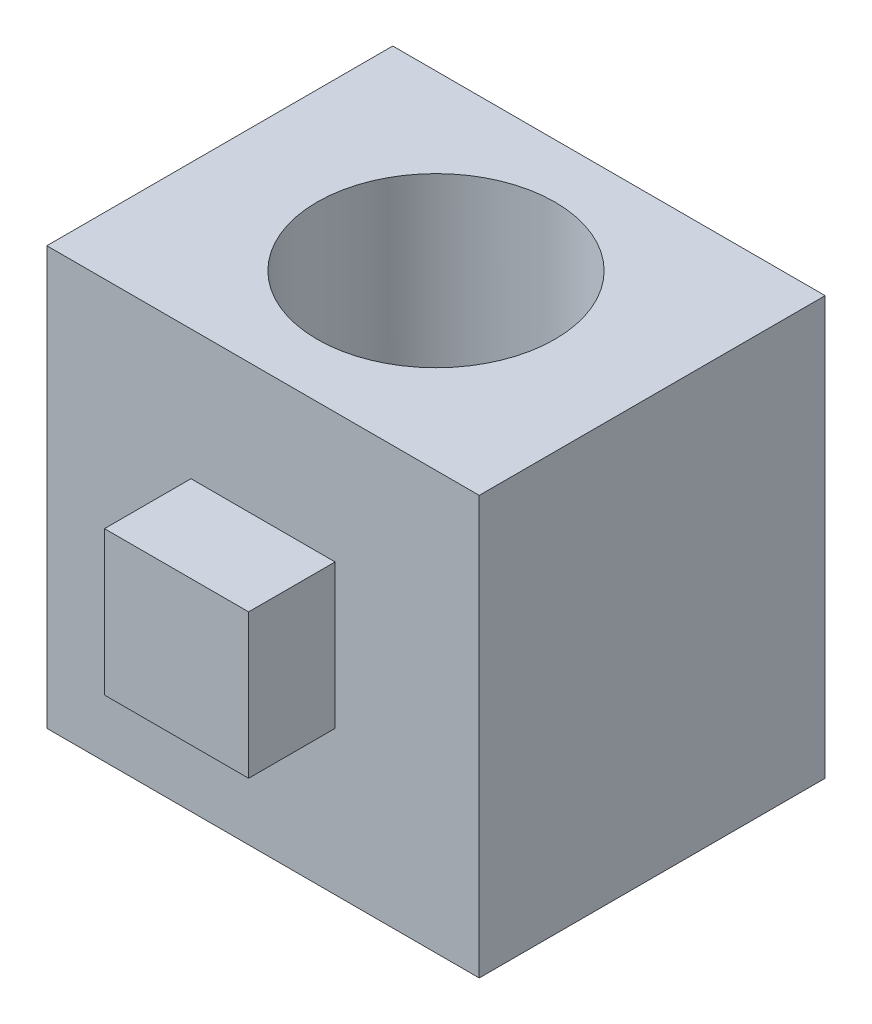
ISO-10303-21;
HEADER;
FILE_DESCRIPTION(('STEP AP214'),'2;1');
FILE_NAME('part.step','',(''),(''),'','','');
FILE_SCHEMA(('AUTOMOTIVE_DESIGN { 1 0 10303 214 1 1 1 1 }'));
ENDSEC;
DATA;
#1=APPLICATION_CONTEXT('core data for automotive mechanical design processes');
#2=APPLICATION_PROTOCOL_DEFINITION('international standard','automotive_design',2000,#1);
#3=PRODUCT_CONTEXT('',#1,'mechanical');
#4=PRODUCT('Part','Part','',(#3));
#5=PRODUCT_RELATED_PRODUCT_CATEGORY('part','',(#4));
#6=PRODUCT_DEFINITION_FORMATION('','',#4);
#7=PRODUCT_DEFINITION_CONTEXT('part definition',#1,'design');
#8=PRODUCT_DEFINITION('design','',#6,#7);
#9=PRODUCT_DEFINITION_SHAPE('','',#8);
#10=(LENGTH_UNIT() NAMED_UNIT(*) SI_UNIT(.MILLI.,.METRE.));
#11=(NAMED_UNIT(*) PLANE_ANGLE_UNIT() SI_UNIT($,.RADIAN.));
#12=(NAMED_UNIT(*) SI_UNIT($,.STERADIAN.) SOLID_ANGLE_UNIT());
#13=UNCERTAINTY_MEASURE_WITH_UNIT(LENGTH_MEASURE(1.E-05),#10,'distance_accuracy_value','');
#14=(GEOMETRIC_REPRESENTATION_CONTEXT(3) GLOBAL_UNCERTAINTY_ASSIGNED_CONTEXT((#13)) GLOBAL_UNIT_ASSIGNED_CONTEXT((#10,
#11,#12)) REPRESENTATION_CONTEXT('',''));
#15=CARTESIAN_POINT('',(0.,0.,0.));
#16=DIRECTION('',(0.,0.,1.));
#17=DIRECTION('',(1.,0.,0.));
#18=AXIS2_PLACEMENT_3D('',#15,#16,#17);
#19=CARTESIAN_POINT('',(-15.,29.,12.));
#20=DIRECTION('',(1.,0.,0.));
#21=DIRECTION('',(0.,0.,-1.));
#22=AXIS2_PLACEMENT_3D('',#19,#20,#21);
#23=PLANE('',#22);
#24=DIRECTION('',(0.,-1.,0.));
#25=VECTOR('',#24,1.);
#26=CARTESIAN_POINT('',(-15.,29.,-12.));
#27=LINE('',#26,#25);
#28=CARTESIAN_POINT('',(-15.,29.,-12.));
#29=VERTEX_POINT('',#28);
#30=CARTESIAN_POINT('',(-15.,0.,-12.));
#31=VERTEX_POINT('',#30);
#32=EDGE_CURVE('E134',#29,#31,#27,.T.);
#33=ORIENTED_EDGE('',*,*,#32,.T.);
#34=DIRECTION('',(0.,0.,-1.));
#35=VECTOR('',#34,1.);
#36=CARTESIAN_POINT('',(-15.,0.,12.));
#37=LINE('',#36,#35);
#38=CARTESIAN_POINT('',(-15.,0.,12.));
#39=VERTEX_POINT('',#38);
#40=EDGE_CURVE('E11',#39,#31,#37,.T.);
#41=ORIENTED_EDGE('',*,*,#40,.F.);
#42=DIRECTION('',(0.,-1.,0.));
#43=VECTOR('',#42,1.);
#44=CARTESIAN_POINT('',(-15.,29.,12.));
#45=LINE('',#44,#43);
#46=CARTESIAN_POINT('',(-15.,29.,12.));
#47=VERTEX_POINT('',#46);
#48=EDGE_CURVE('E139',#47,#39,#45,.T.);
#49=ORIENTED_EDGE('',*,*,#48,.F.);
#50=DIRECTION('',(0.,0.,-1.));
#51=VECTOR('',#50,1.);
#52=CARTESIAN_POINT('',(-15.,29.,12.));
#53=LINE('',#52,#51);
#54=EDGE_CURVE('E148',#47,#29,#53,.T.);
#55=ORIENTED_EDGE('',*,*,#54,.T.);
#56=EDGE_LOOP('',(#33,#41,#49,#55));
#57=FACE_BOUND('',#56,.T.);
#58=ADVANCED_FACE('F41',(#57),#23,.F.);
#59=CARTESIAN_POINT('',(-15.,0.,12.));
#60=DIRECTION('',(0.,1.,0.));
#61=DIRECTION('',(0.,0.,1.));
#62=AXIS2_PLACEMENT_3D('',#59,#60,#61);
#63=PLANE('',#62);
#64=CARTESIAN_POINT('',(0.,0.,0.));
#65=DIRECTION('',(0.,1.,0.));
#66=DIRECTION('',(0.,0.,1.));
#67=AXIS2_PLACEMENT_3D('',#64,#65,#66);
#68=CIRCLE('',#67,8.25);
#69=CARTESIAN_POINT('',(0.,0.,8.25));
#70=VERTEX_POINT('',#69);
#71=EDGE_CURVE('E126',#70,#70,#68,.T.);
#72=ORIENTED_EDGE('',*,*,#71,.T.);
#73=EDGE_LOOP('',(#72));
#74=FACE_BOUND('',#73,.T.);
#75=DIRECTION('',(1.,0.,0.));
#76=VECTOR('',#75,1.);
#77=CARTESIAN_POINT('',(-15.,0.,-12.));
#78=LINE('',#77,#76);
#79=CARTESIAN_POINT('',(15.,0.,-12.));
#80=VERTEX_POINT('',#79);
#81=EDGE_CURVE('E149',#31,#80,#78,.T.);
#82=ORIENTED_EDGE('',*,*,#81,.T.);
#83=DIRECTION('',(0.,0.,-1.));
#84=VECTOR('',#83,1.);
#85=CARTESIAN_POINT('',(15.,0.,12.));
#86=LINE('',#85,#84);
#87=CARTESIAN_POINT('',(15.,0.,12.));
#88=VERTEX_POINT('',#87);
#89=EDGE_CURVE('E47',#88,#80,#86,.T.);
#90=ORIENTED_EDGE('',*,*,#89,.F.);
#91=DIRECTION('',(1.,0.,0.));
#92=VECTOR('',#91,1.);
#93=CARTESIAN_POINT('',(-15.,0.,12.));
#94=LINE('',#93,#92);
#95=EDGE_CURVE('E138',#39,#88,#94,.T.);
#96=ORIENTED_EDGE('',*,*,#95,.F.);
#97=ORIENTED_EDGE('',*,*,#40,.T.);
#98=EDGE_LOOP('',(#82,#90,#96,#97));
#99=FACE_BOUND('',#98,.T.);
#100=ADVANCED_FACE('F177',(#74,#99),#63,.F.);
#101=CARTESIAN_POINT('',(15.,0.,12.));
#102=DIRECTION('',(-1.,0.,0.));
#103=DIRECTION('',(0.,0.,1.));
#104=AXIS2_PLACEMENT_3D('',#101,#102,#103);
#105=PLANE('',#104);
#106=DIRECTION('',(0.,1.,0.));
#107=VECTOR('',#106,1.);
#108=CARTESIAN_POINT('',(15.,0.,-12.));
#109=LINE('',#108,#107);
#110=CARTESIAN_POINT('',(15.,29.,-12.));
#111=VERTEX_POINT('',#110);
#112=EDGE_CURVE('E151',#80,#111,#109,.T.);
#113=ORIENTED_EDGE('',*,*,#112,.T.);
#114=DIRECTION('',(0.,0.,-1.));
#115=VECTOR('',#114,1.);
#116=CARTESIAN_POINT('',(15.,29.,12.));
#117=LINE('',#116,#115);
#118=CARTESIAN_POINT('',(15.,29.,12.));
#119=VERTEX_POINT('',#118);
#120=EDGE_CURVE('E156',#119,#111,#117,.T.);
#121=ORIENTED_EDGE('',*,*,#120,.F.);
#122=DIRECTION('',(0.,1.,0.));
#123=VECTOR('',#122,1.);
#124=CARTESIAN_POINT('',(15.,0.,12.));
#125=LINE('',#124,#123);
#126=EDGE_CURVE('E142',#88,#119,#125,.T.);
#127=ORIENTED_EDGE('',*,*,#126,.F.);
#128=ORIENTED_EDGE('',*,*,#89,.T.);
#129=EDGE_LOOP('',(#113,#121,#127,#128));
#130=FACE_BOUND('',#129,.T.);
#131=ADVANCED_FACE('F163',(#130),#105,.F.);
#132=CARTESIAN_POINT('',(15.,29.,12.));
#133=DIRECTION('',(0.,-1.,0.));
#134=DIRECTION('',(0.,0.,-1.));
#135=AXIS2_PLACEMENT_3D('',#132,#133,#134);
#136=PLANE('',#135);
#137=CARTESIAN_POINT('',(0.,29.,0.));
#138=DIRECTION('',(0.,-1.,0.));
#139=DIRECTION('',(0.,0.,-1.));
#140=AXIS2_PLACEMENT_3D('',#137,#138,#139);
#141=CIRCLE('',#140,8.25);
#142=CARTESIAN_POINT('',(0.,29.,-8.25));
#143=VERTEX_POINT('',#142);
#144=EDGE_CURVE('E42',#143,#143,#141,.T.);
#145=ORIENTED_EDGE('',*,*,#144,.T.);
#146=EDGE_LOOP('',(#145));
#147=FACE_BOUND('',#146,.T.);
#148=DIRECTION('',(-1.,0.,0.));
#149=VECTOR('',#148,1.);
#150=CARTESIAN_POINT('',(15.,29.,-12.));
#151=LINE('',#150,#149);
#152=EDGE_CURVE('E137',#111,#29,#151,.T.);
#153=ORIENTED_EDGE('',*,*,#152,.T.);
#154=ORIENTED_EDGE('',*,*,#54,.F.);
#155=DIRECTION('',(-1.,0.,0.));
#156=VECTOR('',#155,1.);
#157=CARTESIAN_POINT('',(15.,29.,12.));
#158=LINE('',#157,#156);
#159=EDGE_CURVE('E145',#119,#47,#158,.T.);
#160=ORIENTED_EDGE('',*,*,#159,.F.);
#161=ORIENTED_EDGE('',*,*,#120,.T.);
#162=EDGE_LOOP('',(#153,#154,#160,#161));
#163=FACE_BOUND('',#162,.T.);
#164=ADVANCED_FACE('F171',(#147,#163),#136,.F.);
#165=CARTESIAN_POINT('',(0.,0.,12.));
#166=DIRECTION('',(0.,0.,1.));
#167=DIRECTION('',(1.,0.,0.));
#168=AXIS2_PLACEMENT_3D('',#165,#166,#167);
#169=PLANE('',#168);
#170=DIRECTION('',(0.,-1.,0.));
#171=VECTOR('',#170,1.);
#172=CARTESIAN_POINT('',(-5.,20.,12.));
#173=LINE('',#172,#171);
#174=CARTESIAN_POINT('',(-5.,20.,12.));
#175=VERTEX_POINT('',#174);
#176=CARTESIAN_POINT('',(-5.,10.,12.));
#177=VERTEX_POINT('',#176);
#178=EDGE_CURVE('E57',#175,#177,#173,.T.);
#179=ORIENTED_EDGE('',*,*,#178,.F.);
#180=DIRECTION('',(-1.,0.,0.));
#181=VECTOR('',#180,1.);
#182=CARTESIAN_POINT('',(5.,20.,12.));
#183=LINE('',#182,#181);
#184=CARTESIAN_POINT('',(5.,20.,12.));
#185=VERTEX_POINT('',#184);
#186=EDGE_CURVE('E58',#185,#175,#183,.T.);
#187=ORIENTED_EDGE('',*,*,#186,.F.);
#188=DIRECTION('',(0.,1.,0.));
#189=VECTOR('',#188,1.);
#190=CARTESIAN_POINT('',(5.,10.,12.));
#191=LINE('',#190,#189);
#192=CARTESIAN_POINT('',(5.,10.,12.));
#193=VERTEX_POINT('',#192);
#194=EDGE_CURVE('E289',#193,#185,#191,.T.);
#195=ORIENTED_EDGE('',*,*,#194,.F.);
#196=DIRECTION('',(1.,0.,0.));
#197=VECTOR('',#196,1.);
#198=CARTESIAN_POINT('',(-5.,10.,12.));
#199=LINE('',#198,#197);
#200=EDGE_CURVE('E295',#177,#193,#199,.T.);
#201=ORIENTED_EDGE('',*,*,#200,.F.);
#202=EDGE_LOOP('',(#179,#187,#195,#201));
#203=FACE_BOUND('',#202,.T.);
#204=ORIENTED_EDGE('',*,*,#48,.T.);
#205=ORIENTED_EDGE('',*,*,#95,.T.);
#206=ORIENTED_EDGE('',*,*,#126,.T.);
#207=ORIENTED_EDGE('',*,*,#159,.T.);
#208=EDGE_LOOP('',(#204,#205,#206,#207));
#209=FACE_BOUND('',#208,.T.);
#210=ADVANCED_FACE('F178',(#203,#209),#169,.T.);
#211=CARTESIAN_POINT('',(0.,0.,-12.));
#212=DIRECTION('',(0.,0.,1.));
#213=DIRECTION('',(1.,0.,0.));
#214=AXIS2_PLACEMENT_3D('',#211,#212,#213);
#215=PLANE('',#214);
#216=ORIENTED_EDGE('',*,*,#32,.F.);
#217=ORIENTED_EDGE('',*,*,#152,.F.);
#218=ORIENTED_EDGE('',*,*,#112,.F.);
#219=ORIENTED_EDGE('',*,*,#81,.F.);
#220=EDGE_LOOP('',(#216,#217,#218,#219));
#221=FACE_BOUND('',#220,.T.);
#222=ADVANCED_FACE('F168',(#221),#215,.F.);
#223=CARTESIAN_POINT('',(0.,-34.,0.));
#224=DIRECTION('',(0.,1.,0.));
#225=DIRECTION('',(0.,0.,1.));
#226=AXIS2_PLACEMENT_3D('',#223,#224,#225);
#227=CYLINDRICAL_SURFACE('',#226,8.25);
#228=ORIENTED_EDGE('',*,*,#144,.F.);
#229=EDGE_LOOP('',(#228));
#230=FACE_BOUND('',#229,.T.);
#231=ORIENTED_EDGE('',*,*,#71,.F.);
#232=EDGE_LOOP('',(#231));
#233=FACE_BOUND('',#232,.T.);
#234=ADVANCED_FACE('F193',(#230,#233),#227,.F.);
#235=CARTESIAN_POINT('',(-5.,20.,18.));
#236=DIRECTION('',(1.,0.,0.));
#237=DIRECTION('',(0.,0.,-1.));
#238=AXIS2_PLACEMENT_3D('',#235,#236,#237);
#239=PLANE('',#238);
#240=ORIENTED_EDGE('',*,*,#178,.T.);
#241=DIRECTION('',(0.,0.,-1.));
#242=VECTOR('',#241,1.);
#243=CARTESIAN_POINT('',(-5.,10.,18.));
#244=LINE('',#243,#242);
#245=CARTESIAN_POINT('',(-5.,10.,18.));
#246=VERTEX_POINT('',#245);
#247=EDGE_CURVE('E108',#246,#177,#244,.T.);
#248=ORIENTED_EDGE('',*,*,#247,.F.);
#249=DIRECTION('',(0.,-1.,0.));
#250=VECTOR('',#249,1.);
#251=CARTESIAN_POINT('',(-5.,20.,18.));
#252=LINE('',#251,#250);
#253=CARTESIAN_POINT('',(-5.,20.,18.));
#254=VERTEX_POINT('',#253);
#255=EDGE_CURVE('E113',#254,#246,#252,.T.);
#256=ORIENTED_EDGE('',*,*,#255,.F.);
#257=DIRECTION('',(0.,0.,-1.));
#258=VECTOR('',#257,1.);
#259=CARTESIAN_POINT('',(-5.,20.,18.));
#260=LINE('',#259,#258);
#261=EDGE_CURVE('E282',#254,#175,#260,.T.);
#262=ORIENTED_EDGE('',*,*,#261,.T.);
#263=EDGE_LOOP('',(#240,#248,#256,#262));
#264=FACE_BOUND('',#263,.T.);
#265=ADVANCED_FACE('F122',(#264),#239,.F.);
#266=CARTESIAN_POINT('',(-5.,10.,18.));
#267=DIRECTION('',(0.,1.,0.));
#268=DIRECTION('',(0.,0.,1.));
#269=AXIS2_PLACEMENT_3D('',#266,#267,#268);
#270=PLANE('',#269);
#271=ORIENTED_EDGE('',*,*,#200,.T.);
#272=DIRECTION('',(0.,0.,-1.));
#273=VECTOR('',#272,1.);
#274=CARTESIAN_POINT('',(5.,10.,18.));
#275=LINE('',#274,#273);
#276=CARTESIAN_POINT('',(5.,10.,18.));
#277=VERTEX_POINT('',#276);
#278=EDGE_CURVE('E112',#277,#193,#275,.T.);
#279=ORIENTED_EDGE('',*,*,#278,.F.);
#280=DIRECTION('',(1.,0.,0.));
#281=VECTOR('',#280,1.);
#282=CARTESIAN_POINT('',(-5.,10.,18.));
#283=LINE('',#282,#281);
#284=EDGE_CURVE('E102',#246,#277,#283,.T.);
#285=ORIENTED_EDGE('',*,*,#284,.F.);
#286=ORIENTED_EDGE('',*,*,#247,.T.);
#287=EDGE_LOOP('',(#271,#279,#285,#286));
#288=FACE_BOUND('',#287,.T.);
#289=ADVANCED_FACE('F110',(#288),#270,.F.);
#290=CARTESIAN_POINT('',(5.,10.,18.));
#291=DIRECTION('',(-1.,0.,0.));
#292=DIRECTION('',(0.,0.,1.));
#293=AXIS2_PLACEMENT_3D('',#290,#291,#292);
#294=PLANE('',#293);
#295=ORIENTED_EDGE('',*,*,#194,.T.);
#296=DIRECTION('',(0.,0.,-1.));
#297=VECTOR('',#296,1.);
#298=CARTESIAN_POINT('',(5.,20.,18.));
#299=LINE('',#298,#297);
#300=CARTESIAN_POINT('',(5.,20.,18.));
#301=VERTEX_POINT('',#300);
#302=EDGE_CURVE('E129',#301,#185,#299,.T.);
#303=ORIENTED_EDGE('',*,*,#302,.F.);
#304=DIRECTION('',(0.,1.,0.));
#305=VECTOR('',#304,1.);
#306=CARTESIAN_POINT('',(5.,10.,18.));
#307=LINE('',#306,#305);
#308=EDGE_CURVE('E111',#277,#301,#307,.T.);
#309=ORIENTED_EDGE('',*,*,#308,.F.);
#310=ORIENTED_EDGE('',*,*,#278,.T.);
#311=EDGE_LOOP('',(#295,#303,#309,#310));
#312=FACE_BOUND('',#311,.T.);
#313=ADVANCED_FACE('F204',(#312),#294,.F.);
#314=CARTESIAN_POINT('',(5.,20.,18.));
#315=DIRECTION('',(0.,-1.,0.));
#316=DIRECTION('',(0.,0.,-1.));
#317=AXIS2_PLACEMENT_3D('',#314,#315,#316);
#318=PLANE('',#317);
#319=ORIENTED_EDGE('',*,*,#186,.T.);
#320=ORIENTED_EDGE('',*,*,#261,.F.);
#321=DIRECTION('',(-1.,0.,0.));
#322=VECTOR('',#321,1.);
#323=CARTESIAN_POINT('',(5.,20.,18.));
#324=LINE('',#323,#322);
#325=EDGE_CURVE('E119',#301,#254,#324,.T.);
#326=ORIENTED_EDGE('',*,*,#325,.F.);
#327=ORIENTED_EDGE('',*,*,#302,.T.);
#328=EDGE_LOOP('',(#319,#320,#326,#327));
#329=FACE_BOUND('',#328,.T.);
#330=ADVANCED_FACE('F210',(#329),#318,.F.);
#331=CARTESIAN_POINT('',(0.,0.,18.));
#332=DIRECTION('',(0.,0.,1.));
#333=DIRECTION('',(1.,0.,0.));
#334=AXIS2_PLACEMENT_3D('',#331,#332,#333);
#335=PLANE('',#334);
#336=ORIENTED_EDGE('',*,*,#255,.T.);
#337=ORIENTED_EDGE('',*,*,#284,.T.);
#338=ORIENTED_EDGE('',*,*,#308,.T.);
#339=ORIENTED_EDGE('',*,*,#325,.T.);
#340=EDGE_LOOP('',(#336,#337,#338,#339));
#341=FACE_BOUND('',#340,.T.);
#342=ADVANCED_FACE('F116',(#341),#335,.T.);
#343=CLOSED_SHELL('',(#58,#100,#131,#164,#210,#222,#234,#265,#289,#313,#330,#342));
#344=MANIFOLD_SOLID_BREP('B2',#343);
#345=ADVANCED_BREP_SHAPE_REPRESENTATION('',(#18,#344),#14);
#346=SHAPE_DEFINITION_REPRESENTATION(#9,#345);
ENDSEC;
END-ISO-10303-21;
